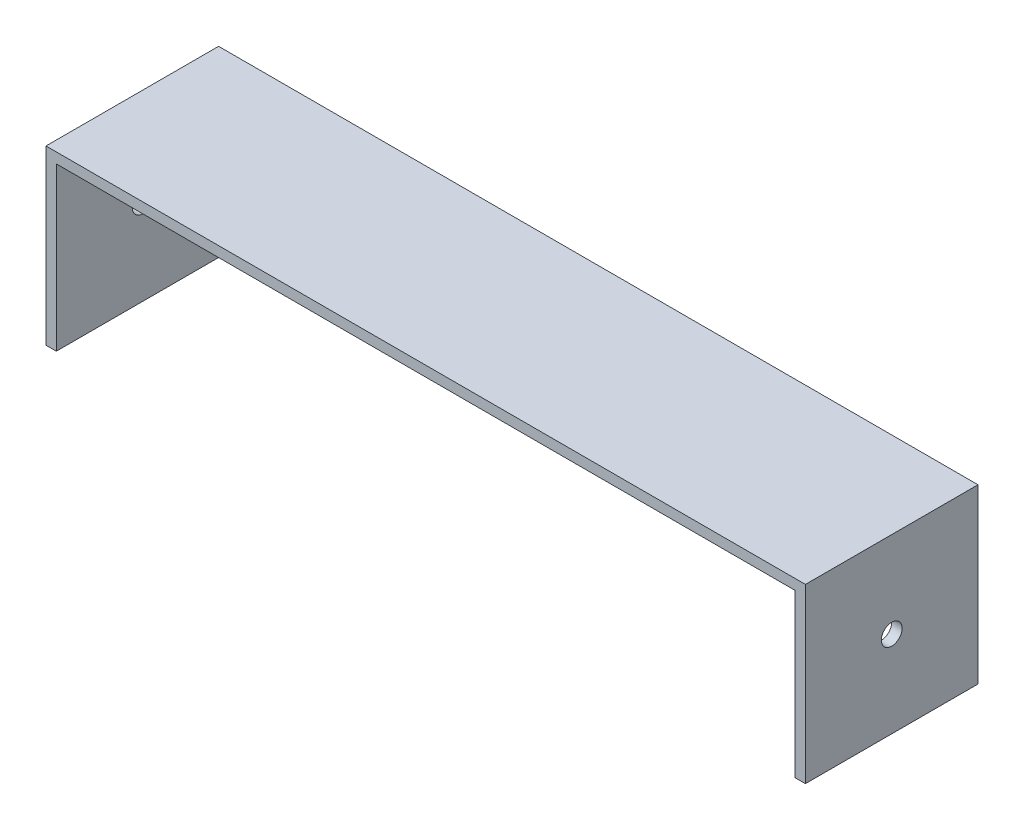
ISO-10303-21;
HEADER;
FILE_DESCRIPTION(('STEP AP214'),'2;1');
FILE_NAME('part.step','',(''),(''),'','','');
FILE_SCHEMA(('AUTOMOTIVE_DESIGN { 1 0 10303 214 1 1 1 1 }'));
ENDSEC;
DATA;
#1=APPLICATION_CONTEXT('core data for automotive mechanical design processes');
#2=APPLICATION_PROTOCOL_DEFINITION('international standard','automotive_design',2000,#1);
#3=PRODUCT_CONTEXT('',#1,'mechanical');
#4=PRODUCT('Part','Part','',(#3));
#5=PRODUCT_RELATED_PRODUCT_CATEGORY('part','',(#4));
#6=PRODUCT_DEFINITION_FORMATION('','',#4);
#7=PRODUCT_DEFINITION_CONTEXT('part definition',#1,'design');
#8=PRODUCT_DEFINITION('design','',#6,#7);
#9=PRODUCT_DEFINITION_SHAPE('','',#8);
#10=(LENGTH_UNIT() NAMED_UNIT(*) SI_UNIT(.MILLI.,.METRE.));
#11=(NAMED_UNIT(*) PLANE_ANGLE_UNIT() SI_UNIT($,.RADIAN.));
#12=(NAMED_UNIT(*) SI_UNIT($,.STERADIAN.) SOLID_ANGLE_UNIT());
#13=UNCERTAINTY_MEASURE_WITH_UNIT(LENGTH_MEASURE(1.E-05),#10,'distance_accuracy_value','');
#14=(GEOMETRIC_REPRESENTATION_CONTEXT(3) GLOBAL_UNCERTAINTY_ASSIGNED_CONTEXT((#13)) GLOBAL_UNIT_ASSIGNED_CONTEXT((#10,
#11,#12)) REPRESENTATION_CONTEXT('',''));
#15=CARTESIAN_POINT('',(0.,0.,0.));
#16=DIRECTION('',(0.,0.,1.));
#17=DIRECTION('',(1.,0.,0.));
#18=AXIS2_PLACEMENT_3D('',#15,#16,#17);
#19=CARTESIAN_POINT('',(0.,-1.5,12.5));
#20=DIRECTION('',(0.,0.,1.));
#21=DIRECTION('',(1.,0.,0.));
#22=AXIS2_PLACEMENT_3D('',#19,#20,#21);
#23=PLANE('',#22);
#24=DIRECTION('',(1.,0.,0.));
#25=VECTOR('',#24,1.);
#26=CARTESIAN_POINT('',(0.,0.,12.5));
#27=LINE('',#26,#25);
#28=CARTESIAN_POINT('',(-55.,0.,12.5));
#29=VERTEX_POINT('',#28);
#30=CARTESIAN_POINT('',(55.,0.,12.5));
#31=VERTEX_POINT('',#30);
#32=EDGE_CURVE('E158',#29,#31,#27,.T.);
#33=ORIENTED_EDGE('',*,*,#32,.F.);
#34=DIRECTION('',(0.,1.,0.));
#35=VECTOR('',#34,1.);
#36=CARTESIAN_POINT('',(-55.,-25.,12.5));
#37=LINE('',#36,#35);
#38=CARTESIAN_POINT('',(-55.,-25.,12.5));
#39=VERTEX_POINT('',#38);
#40=EDGE_CURVE('E159',#39,#29,#37,.T.);
#41=ORIENTED_EDGE('',*,*,#40,.F.);
#42=DIRECTION('',(-1.,0.,0.));
#43=VECTOR('',#42,1.);
#44=CARTESIAN_POINT('',(1.0119220276531E-13,-25.,12.4999999999996));
#45=LINE('',#44,#43);
#46=CARTESIAN_POINT('',(-53.5,-25.,12.5));
#47=VERTEX_POINT('',#46);
#48=EDGE_CURVE('E151',#47,#39,#45,.T.);
#49=ORIENTED_EDGE('',*,*,#48,.F.);
#50=DIRECTION('',(0.,1.,0.));
#51=VECTOR('',#50,1.);
#52=CARTESIAN_POINT('',(-53.5,-25.,12.5));
#53=LINE('',#52,#51);
#54=CARTESIAN_POINT('',(-53.5,-1.5,12.5));
#55=VERTEX_POINT('',#54);
#56=EDGE_CURVE('E155',#47,#55,#53,.T.);
#57=ORIENTED_EDGE('',*,*,#56,.T.);
#58=DIRECTION('',(1.,0.,0.));
#59=VECTOR('',#58,1.);
#60=CARTESIAN_POINT('',(0.,-1.5,12.5));
#61=LINE('',#60,#59);
#62=CARTESIAN_POINT('',(53.5,-1.5,12.5));
#63=VERTEX_POINT('',#62);
#64=EDGE_CURVE('E165',#55,#63,#61,.T.);
#65=ORIENTED_EDGE('',*,*,#64,.T.);
#66=DIRECTION('',(0.,1.,0.));
#67=VECTOR('',#66,1.);
#68=CARTESIAN_POINT('',(53.5,-25.,12.5));
#69=LINE('',#68,#67);
#70=CARTESIAN_POINT('',(53.5,-25.,12.5));
#71=VERTEX_POINT('',#70);
#72=EDGE_CURVE('E139',#71,#63,#69,.T.);
#73=ORIENTED_EDGE('',*,*,#72,.F.);
#74=DIRECTION('',(1.,0.,0.));
#75=VECTOR('',#74,1.);
#76=CARTESIAN_POINT('',(-1.0119220276531E-13,-25.,12.4999999999996));
#77=LINE('',#76,#75);
#78=CARTESIAN_POINT('',(55.,-25.,12.5));
#79=VERTEX_POINT('',#78);
#80=EDGE_CURVE('E122',#71,#79,#77,.T.);
#81=ORIENTED_EDGE('',*,*,#80,.T.);
#82=DIRECTION('',(0.,1.,0.));
#83=VECTOR('',#82,1.);
#84=CARTESIAN_POINT('',(55.,-25.,12.5));
#85=LINE('',#84,#83);
#86=EDGE_CURVE('E126',#79,#31,#85,.T.);
#87=ORIENTED_EDGE('',*,*,#86,.T.);
#88=EDGE_LOOP('',(#33,#41,#49,#57,#65,#73,#81,#87));
#89=FACE_BOUND('',#88,.T.);
#90=ADVANCED_FACE('F36',(#89),#23,.T.);
#91=CARTESIAN_POINT('',(0.,-1.5,-12.5));
#92=DIRECTION('',(0.,0.,1.));
#93=DIRECTION('',(1.,0.,0.));
#94=AXIS2_PLACEMENT_3D('',#91,#92,#93);
#95=PLANE('',#94);
#96=DIRECTION('',(1.,0.,0.));
#97=VECTOR('',#96,1.);
#98=CARTESIAN_POINT('',(0.,0.,-12.5));
#99=LINE('',#98,#97);
#100=CARTESIAN_POINT('',(-55.,0.,-12.5));
#101=VERTEX_POINT('',#100);
#102=CARTESIAN_POINT('',(55.,0.,-12.5));
#103=VERTEX_POINT('',#102);
#104=EDGE_CURVE('E39',#101,#103,#99,.T.);
#105=ORIENTED_EDGE('',*,*,#104,.T.);
#106=DIRECTION('',(0.,1.,0.));
#107=VECTOR('',#106,1.);
#108=CARTESIAN_POINT('',(55.,-25.,-12.5));
#109=LINE('',#108,#107);
#110=CARTESIAN_POINT('',(55.,-25.,-12.5));
#111=VERTEX_POINT('',#110);
#112=EDGE_CURVE('E115',#111,#103,#109,.T.);
#113=ORIENTED_EDGE('',*,*,#112,.F.);
#114=DIRECTION('',(1.,0.,0.));
#115=VECTOR('',#114,1.);
#116=CARTESIAN_POINT('',(1.15648231731792E-13,-25.,-12.5000000000005));
#117=LINE('',#116,#115);
#118=CARTESIAN_POINT('',(53.5,-25.,-12.5));
#119=VERTEX_POINT('',#118);
#120=EDGE_CURVE('E101',#119,#111,#117,.T.);
#121=ORIENTED_EDGE('',*,*,#120,.F.);
#122=DIRECTION('',(0.,1.,0.));
#123=VECTOR('',#122,1.);
#124=CARTESIAN_POINT('',(53.5,-25.,-12.5));
#125=LINE('',#124,#123);
#126=CARTESIAN_POINT('',(53.5,-1.5,-12.5));
#127=VERTEX_POINT('',#126);
#128=EDGE_CURVE('E121',#119,#127,#125,.T.);
#129=ORIENTED_EDGE('',*,*,#128,.T.);
#130=DIRECTION('',(1.,0.,0.));
#131=VECTOR('',#130,1.);
#132=CARTESIAN_POINT('',(0.,-1.5,-12.5));
#133=LINE('',#132,#131);
#134=CARTESIAN_POINT('',(-53.5,-1.5,-12.5));
#135=VERTEX_POINT('',#134);
#136=EDGE_CURVE('E44',#135,#127,#133,.T.);
#137=ORIENTED_EDGE('',*,*,#136,.F.);
#138=DIRECTION('',(0.,1.,0.));
#139=VECTOR('',#138,1.);
#140=CARTESIAN_POINT('',(-53.5,-25.,-12.5));
#141=LINE('',#140,#139);
#142=CARTESIAN_POINT('',(-53.5,-25.,-12.5));
#143=VERTEX_POINT('',#142);
#144=EDGE_CURVE('E52',#143,#135,#141,.T.);
#145=ORIENTED_EDGE('',*,*,#144,.F.);
#146=DIRECTION('',(-1.,0.,0.));
#147=VECTOR('',#146,1.);
#148=CARTESIAN_POINT('',(-1.15648231731792E-13,-25.,-12.5000000000005));
#149=LINE('',#148,#147);
#150=CARTESIAN_POINT('',(-55.,-25.,-12.5));
#151=VERTEX_POINT('',#150);
#152=EDGE_CURVE('E145',#143,#151,#149,.T.);
#153=ORIENTED_EDGE('',*,*,#152,.T.);
#154=DIRECTION('',(0.,1.,0.));
#155=VECTOR('',#154,1.);
#156=CARTESIAN_POINT('',(-55.,-25.,-12.5));
#157=LINE('',#156,#155);
#158=EDGE_CURVE('E162',#151,#101,#157,.T.);
#159=ORIENTED_EDGE('',*,*,#158,.T.);
#160=EDGE_LOOP('',(#105,#113,#121,#129,#137,#145,#153,#159));
#161=FACE_BOUND('',#160,.T.);
#162=ADVANCED_FACE('F116',(#161),#95,.F.);
#163=CARTESIAN_POINT('',(0.,-1.5,0.));
#164=DIRECTION('',(0.,1.,0.));
#165=DIRECTION('',(0.,0.,1.));
#166=AXIS2_PLACEMENT_3D('',#163,#164,#165);
#167=PLANE('',#166);
#168=ORIENTED_EDGE('',*,*,#64,.F.);
#169=DIRECTION('',(0.,0.,-1.));
#170=VECTOR('',#169,1.);
#171=CARTESIAN_POINT('',(-53.5,-1.5,0.));
#172=LINE('',#171,#170);
#173=EDGE_CURVE('E11',#55,#135,#172,.T.);
#174=ORIENTED_EDGE('',*,*,#173,.T.);
#175=ORIENTED_EDGE('',*,*,#136,.T.);
#176=DIRECTION('',(0.,0.,-1.));
#177=VECTOR('',#176,1.);
#178=CARTESIAN_POINT('',(53.5,-1.5,0.));
#179=LINE('',#178,#177);
#180=EDGE_CURVE('E59',#63,#127,#179,.T.);
#181=ORIENTED_EDGE('',*,*,#180,.F.);
#182=EDGE_LOOP('',(#168,#174,#175,#181));
#183=FACE_BOUND('',#182,.T.);
#184=ADVANCED_FACE('F177',(#183),#167,.F.);
#185=CARTESIAN_POINT('',(0.,0.,0.));
#186=DIRECTION('',(0.,1.,0.));
#187=DIRECTION('',(0.,0.,1.));
#188=AXIS2_PLACEMENT_3D('',#185,#186,#187);
#189=PLANE('',#188);
#190=ORIENTED_EDGE('',*,*,#32,.T.);
#191=DIRECTION('',(0.,0.,1.));
#192=VECTOR('',#191,1.);
#193=CARTESIAN_POINT('',(55.,0.,0.));
#194=LINE('',#193,#192);
#195=EDGE_CURVE('E128',#103,#31,#194,.T.);
#196=ORIENTED_EDGE('',*,*,#195,.F.);
#197=ORIENTED_EDGE('',*,*,#104,.F.);
#198=DIRECTION('',(0.,0.,1.));
#199=VECTOR('',#198,1.);
#200=CARTESIAN_POINT('',(-55.,0.,0.));
#201=LINE('',#200,#199);
#202=EDGE_CURVE('E138',#101,#29,#201,.T.);
#203=ORIENTED_EDGE('',*,*,#202,.T.);
#204=EDGE_LOOP('',(#190,#196,#197,#203));
#205=FACE_BOUND('',#204,.T.);
#206=ADVANCED_FACE('F169',(#205),#189,.T.);
#207=CARTESIAN_POINT('',(-53.5,-25.,0.));
#208=DIRECTION('',(1.,0.,0.));
#209=DIRECTION('',(0.,0.,-1.));
#210=AXIS2_PLACEMENT_3D('',#207,#208,#209);
#211=PLANE('',#210);
#212=CARTESIAN_POINT('',(-53.5,-12.5,0.));
#213=DIRECTION('',(1.,0.,0.));
#214=DIRECTION('',(0.,0.,-1.));
#215=AXIS2_PLACEMENT_3D('',#212,#213,#214);
#216=CIRCLE('',#215,1.5);
#217=CARTESIAN_POINT('',(-53.5,-12.5,-1.5));
#218=VERTEX_POINT('',#217);
#219=EDGE_CURVE('E130',#218,#218,#216,.T.);
#220=ORIENTED_EDGE('',*,*,#219,.F.);
#221=EDGE_LOOP('',(#220));
#222=FACE_BOUND('',#221,.T.);
#223=ORIENTED_EDGE('',*,*,#173,.F.);
#224=ORIENTED_EDGE('',*,*,#56,.F.);
#225=DIRECTION('',(0.,0.,-1.));
#226=VECTOR('',#225,1.);
#227=CARTESIAN_POINT('',(-53.5,-25.,0.));
#228=LINE('',#227,#226);
#229=EDGE_CURVE('E143',#47,#143,#228,.T.);
#230=ORIENTED_EDGE('',*,*,#229,.T.);
#231=ORIENTED_EDGE('',*,*,#144,.T.);
#232=EDGE_LOOP('',(#223,#224,#230,#231));
#233=FACE_BOUND('',#232,.T.);
#234=ADVANCED_FACE('F178',(#222,#233),#211,.T.);
#235=CARTESIAN_POINT('',(-55.,-25.,0.));
#236=DIRECTION('',(-1.,0.,0.));
#237=DIRECTION('',(0.,0.,1.));
#238=AXIS2_PLACEMENT_3D('',#235,#236,#237);
#239=PLANE('',#238);
#240=CARTESIAN_POINT('',(-55.,-12.5,0.));
#241=DIRECTION('',(1.,0.,0.));
#242=DIRECTION('',(0.,0.,-1.));
#243=AXIS2_PLACEMENT_3D('',#240,#241,#242);
#244=CIRCLE('',#243,1.5);
#245=CARTESIAN_POINT('',(-55.,-12.5,-1.5));
#246=VERTEX_POINT('',#245);
#247=EDGE_CURVE('E274',#246,#246,#244,.T.);
#248=ORIENTED_EDGE('',*,*,#247,.T.);
#249=EDGE_LOOP('',(#248));
#250=FACE_BOUND('',#249,.T.);
#251=ORIENTED_EDGE('',*,*,#202,.F.);
#252=ORIENTED_EDGE('',*,*,#158,.F.);
#253=DIRECTION('',(0.,0.,1.));
#254=VECTOR('',#253,1.);
#255=CARTESIAN_POINT('',(-55.,-25.,0.));
#256=LINE('',#255,#254);
#257=EDGE_CURVE('E148',#151,#39,#256,.T.);
#258=ORIENTED_EDGE('',*,*,#257,.T.);
#259=ORIENTED_EDGE('',*,*,#40,.T.);
#260=EDGE_LOOP('',(#251,#252,#258,#259));
#261=FACE_BOUND('',#260,.T.);
#262=ADVANCED_FACE('F185',(#250,#261),#239,.T.);
#263=CARTESIAN_POINT('',(0.,-25.,0.));
#264=DIRECTION('',(0.,1.,0.));
#265=DIRECTION('',(0.,0.,1.));
#266=AXIS2_PLACEMENT_3D('',#263,#264,#265);
#267=PLANE('',#266);
#268=ORIENTED_EDGE('',*,*,#229,.F.);
#269=ORIENTED_EDGE('',*,*,#48,.T.);
#270=ORIENTED_EDGE('',*,*,#257,.F.);
#271=ORIENTED_EDGE('',*,*,#152,.F.);
#272=EDGE_LOOP('',(#268,#269,#270,#271));
#273=FACE_BOUND('',#272,.T.);
#274=ADVANCED_FACE('F183',(#273),#267,.F.);
#275=CARTESIAN_POINT('',(53.5,-25.,0.));
#276=DIRECTION('',(1.,0.,0.));
#277=DIRECTION('',(0.,0.,-1.));
#278=AXIS2_PLACEMENT_3D('',#275,#276,#277);
#279=PLANE('',#278);
#280=CARTESIAN_POINT('',(53.5,-12.5,0.));
#281=DIRECTION('',(1.,0.,0.));
#282=DIRECTION('',(0.,0.,-1.));
#283=AXIS2_PLACEMENT_3D('',#280,#281,#282);
#284=CIRCLE('',#283,1.5);
#285=CARTESIAN_POINT('',(53.5,-12.5,-1.5));
#286=VERTEX_POINT('',#285);
#287=EDGE_CURVE('E275',#286,#286,#284,.T.);
#288=ORIENTED_EDGE('',*,*,#287,.T.);
#289=EDGE_LOOP('',(#288));
#290=FACE_BOUND('',#289,.T.);
#291=ORIENTED_EDGE('',*,*,#72,.T.);
#292=ORIENTED_EDGE('',*,*,#180,.T.);
#293=ORIENTED_EDGE('',*,*,#128,.F.);
#294=DIRECTION('',(0.,0.,-1.));
#295=VECTOR('',#294,1.);
#296=CARTESIAN_POINT('',(53.5,-25.,0.));
#297=LINE('',#296,#295);
#298=EDGE_CURVE('E109',#71,#119,#297,.T.);
#299=ORIENTED_EDGE('',*,*,#298,.F.);
#300=EDGE_LOOP('',(#291,#292,#293,#299));
#301=FACE_BOUND('',#300,.T.);
#302=ADVANCED_FACE('F174',(#290,#301),#279,.F.);
#303=CARTESIAN_POINT('',(55.,-25.,0.));
#304=DIRECTION('',(-1.,0.,0.));
#305=DIRECTION('',(0.,0.,1.));
#306=AXIS2_PLACEMENT_3D('',#303,#304,#305);
#307=PLANE('',#306);
#308=CARTESIAN_POINT('',(55.,-12.5,0.));
#309=DIRECTION('',(1.,0.,0.));
#310=DIRECTION('',(0.,0.,-1.));
#311=AXIS2_PLACEMENT_3D('',#308,#309,#310);
#312=CIRCLE('',#311,1.5);
#313=CARTESIAN_POINT('',(55.,-12.5,-1.5));
#314=VERTEX_POINT('',#313);
#315=EDGE_CURVE('E276',#314,#314,#312,.T.);
#316=ORIENTED_EDGE('',*,*,#315,.F.);
#317=EDGE_LOOP('',(#316));
#318=FACE_BOUND('',#317,.T.);
#319=ORIENTED_EDGE('',*,*,#195,.T.);
#320=ORIENTED_EDGE('',*,*,#86,.F.);
#321=DIRECTION('',(0.,0.,1.));
#322=VECTOR('',#321,1.);
#323=CARTESIAN_POINT('',(55.,-25.,0.));
#324=LINE('',#323,#322);
#325=EDGE_CURVE('E106',#111,#79,#324,.T.);
#326=ORIENTED_EDGE('',*,*,#325,.F.);
#327=ORIENTED_EDGE('',*,*,#112,.T.);
#328=EDGE_LOOP('',(#319,#320,#326,#327));
#329=FACE_BOUND('',#328,.T.);
#330=ADVANCED_FACE('F124',(#318,#329),#307,.F.);
#331=CARTESIAN_POINT('',(0.,-25.,0.));
#332=DIRECTION('',(0.,1.,0.));
#333=DIRECTION('',(0.,0.,1.));
#334=AXIS2_PLACEMENT_3D('',#331,#332,#333);
#335=PLANE('',#334);
#336=ORIENTED_EDGE('',*,*,#325,.T.);
#337=ORIENTED_EDGE('',*,*,#80,.F.);
#338=ORIENTED_EDGE('',*,*,#298,.T.);
#339=ORIENTED_EDGE('',*,*,#120,.T.);
#340=EDGE_LOOP('',(#336,#337,#338,#339));
#341=FACE_BOUND('',#340,.T.);
#342=ADVANCED_FACE('F103',(#341),#335,.F.);
#343=CARTESIAN_POINT('',(-55.,-12.5,0.));
#344=DIRECTION('',(1.,0.,0.));
#345=DIRECTION('',(0.,0.,-1.));
#346=AXIS2_PLACEMENT_3D('',#343,#344,#345);
#347=CYLINDRICAL_SURFACE('',#346,1.5);
#348=ORIENTED_EDGE('',*,*,#315,.T.);
#349=EDGE_LOOP('',(#348));
#350=FACE_BOUND('',#349,.T.);
#351=ORIENTED_EDGE('',*,*,#287,.F.);
#352=EDGE_LOOP('',(#351));
#353=FACE_BOUND('',#352,.T.);
#354=ADVANCED_FACE('F250',(#350,#353),#347,.F.);
#355=ORIENTED_EDGE('',*,*,#219,.T.);
#356=EDGE_LOOP('',(#355));
#357=FACE_BOUND('',#356,.T.);
#358=ORIENTED_EDGE('',*,*,#247,.F.);
#359=EDGE_LOOP('',(#358));
#360=FACE_BOUND('',#359,.T.);
#361=ADVANCED_FACE('F255',(#357,#360),#347,.F.);
#362=CLOSED_SHELL('',(#90,#162,#184,#206,#234,#262,#274,#302,#330,#342,#354,#361));
#363=MANIFOLD_SOLID_BREP('B2',#362);
#364=ADVANCED_BREP_SHAPE_REPRESENTATION('',(#18,#363),#14);
#365=SHAPE_DEFINITION_REPRESENTATION(#9,#364);
ENDSEC;
END-ISO-10303-21;
